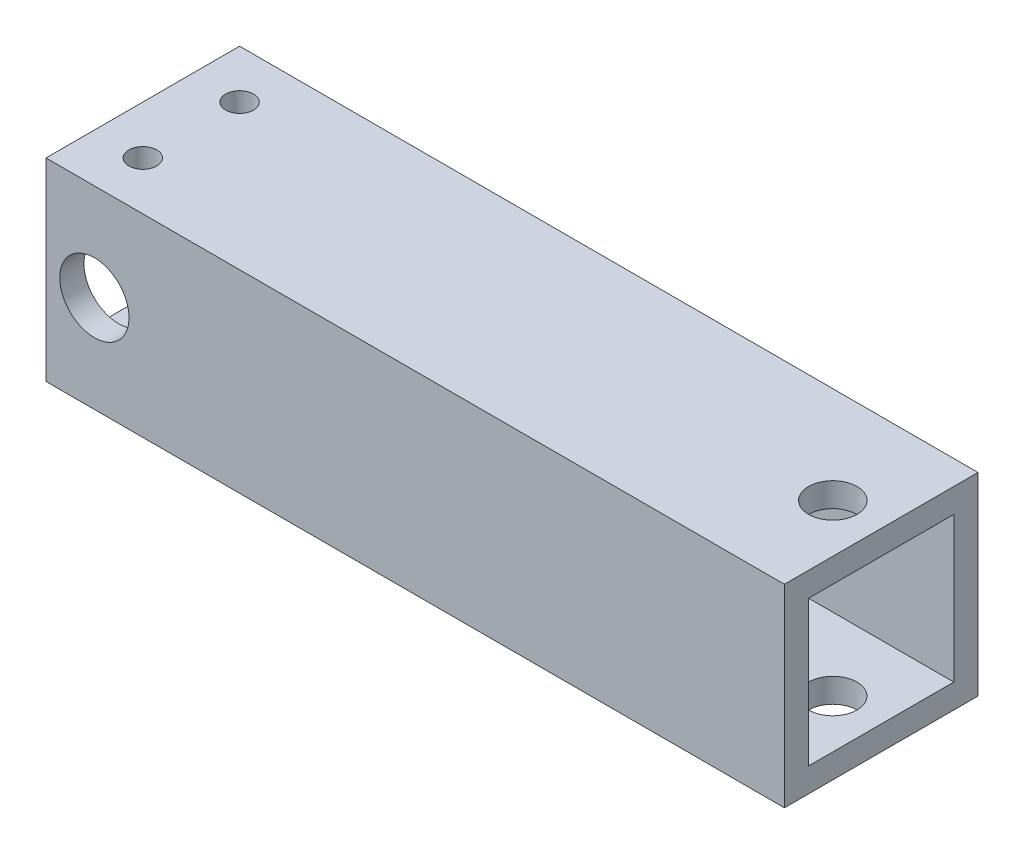
ISO-10303-21;
HEADER;
FILE_DESCRIPTION(('STEP AP214'),'2;1');
FILE_NAME('part.step','',(''),(''),'','','');
FILE_SCHEMA(('AUTOMOTIVE_DESIGN { 1 0 10303 214 1 1 1 1 }'));
ENDSEC;
DATA;
#1=APPLICATION_CONTEXT('core data for automotive mechanical design processes');
#2=APPLICATION_PROTOCOL_DEFINITION('international standard','automotive_design',2000,#1);
#3=PRODUCT_CONTEXT('',#1,'mechanical');
#4=PRODUCT('Part','Part','',(#3));
#5=PRODUCT_RELATED_PRODUCT_CATEGORY('part','',(#4));
#6=PRODUCT_DEFINITION_FORMATION('','',#4);
#7=PRODUCT_DEFINITION_CONTEXT('part definition',#1,'design');
#8=PRODUCT_DEFINITION('design','',#6,#7);
#9=PRODUCT_DEFINITION_SHAPE('','',#8);
#10=(LENGTH_UNIT() NAMED_UNIT(*) SI_UNIT(.MILLI.,.METRE.));
#11=(NAMED_UNIT(*) PLANE_ANGLE_UNIT() SI_UNIT($,.RADIAN.));
#12=(NAMED_UNIT(*) SI_UNIT($,.STERADIAN.) SOLID_ANGLE_UNIT());
#13=UNCERTAINTY_MEASURE_WITH_UNIT(LENGTH_MEASURE(1.E-05),#10,'distance_accuracy_value','');
#14=(GEOMETRIC_REPRESENTATION_CONTEXT(3) GLOBAL_UNCERTAINTY_ASSIGNED_CONTEXT((#13)) GLOBAL_UNIT_ASSIGNED_CONTEXT((#10,
#11,#12)) REPRESENTATION_CONTEXT('',''));
#15=CARTESIAN_POINT('',(0.,0.,0.));
#16=DIRECTION('',(0.,0.,1.));
#17=DIRECTION('',(1.,0.,0.));
#18=AXIS2_PLACEMENT_3D('',#15,#16,#17);
#19=CARTESIAN_POINT('',(-42.926,170.18,-68.2625));
#20=DIRECTION('',(0.,1.,0.));
#21=DIRECTION('',(0.,0.,1.));
#22=AXIS2_PLACEMENT_3D('',#19,#20,#21);
#23=CYLINDRICAL_SURFACE('',#22,1.8288);
#24=CARTESIAN_POINT('',(-42.926,192.405,-68.2625));
#25=DIRECTION('',(0.,1.,0.));
#26=DIRECTION('',(0.,0.,1.));
#27=AXIS2_PLACEMENT_3D('',#24,#25,#26);
#28=CIRCLE('',#27,1.8288);
#29=CARTESIAN_POINT('',(-42.926,192.405,-66.4337));
#30=VERTEX_POINT('',#29);
#31=EDGE_CURVE('E158',#30,#30,#28,.T.);
#32=ORIENTED_EDGE('',*,*,#31,.F.);
#33=EDGE_LOOP('',(#32));
#34=FACE_BOUND('',#33,.T.);
#35=CARTESIAN_POINT('',(-42.926,195.58,-68.2625));
#36=DIRECTION('',(0.,1.,0.));
#37=DIRECTION('',(0.,0.,1.));
#38=AXIS2_PLACEMENT_3D('',#35,#36,#37);
#39=CIRCLE('',#38,1.8288);
#40=CARTESIAN_POINT('',(-42.926,195.58,-66.4337));
#41=VERTEX_POINT('',#40);
#42=EDGE_CURVE('E176',#41,#41,#39,.F.);
#43=ORIENTED_EDGE('',*,*,#42,.F.);
#44=EDGE_LOOP('',(#43));
#45=FACE_BOUND('',#44,.T.);
#46=ADVANCED_FACE('F43',(#34,#45),#23,.F.);
#47=CARTESIAN_POINT('',(41.2500316571236,170.18,-74.6125));
#48=DIRECTION('',(0.,1.,0.));
#49=DIRECTION('',(0.,0.,1.));
#50=AXIS2_PLACEMENT_3D('',#47,#48,#49);
#51=CYLINDRICAL_SURFACE('',#50,3.175);
#52=CARTESIAN_POINT('',(41.2500316571236,192.405,-74.6125));
#53=DIRECTION('',(0.,1.,0.));
#54=DIRECTION('',(0.,0.,1.));
#55=AXIS2_PLACEMENT_3D('',#52,#53,#54);
#56=CIRCLE('',#55,3.175);
#57=CARTESIAN_POINT('',(41.2500316571236,192.405,-71.4375));
#58=VERTEX_POINT('',#57);
#59=EDGE_CURVE('E155',#58,#58,#56,.F.);
#60=ORIENTED_EDGE('',*,*,#59,.T.);
#61=EDGE_LOOP('',(#60));
#62=FACE_BOUND('',#61,.T.);
#63=CARTESIAN_POINT('',(41.2500316571236,195.58,-74.6125));
#64=DIRECTION('',(0.,1.,0.));
#65=DIRECTION('',(0.,0.,1.));
#66=AXIS2_PLACEMENT_3D('',#63,#64,#65);
#67=CIRCLE('',#66,3.175);
#68=CARTESIAN_POINT('',(41.2500316571236,195.58,-71.4375));
#69=VERTEX_POINT('',#68);
#70=EDGE_CURVE('E173',#69,#69,#67,.T.);
#71=ORIENTED_EDGE('',*,*,#70,.T.);
#72=EDGE_LOOP('',(#71));
#73=FACE_BOUND('',#72,.T.);
#74=ADVANCED_FACE('F229',(#62,#73),#51,.F.);
#75=CARTESIAN_POINT('',(-42.926,170.18,-80.9624999999999));
#76=DIRECTION('',(0.,1.,0.));
#77=DIRECTION('',(0.,0.,1.));
#78=AXIS2_PLACEMENT_3D('',#75,#76,#77);
#79=CYLINDRICAL_SURFACE('',#78,1.8288);
#80=CARTESIAN_POINT('',(-42.926,192.405,-80.9624999999999));
#81=DIRECTION('',(0.,1.,0.));
#82=DIRECTION('',(0.,0.,1.));
#83=AXIS2_PLACEMENT_3D('',#80,#81,#82);
#84=CIRCLE('',#83,1.8288);
#85=CARTESIAN_POINT('',(-42.926,192.405,-79.1336999999999));
#86=VERTEX_POINT('',#85);
#87=EDGE_CURVE('E154',#86,#86,#84,.F.);
#88=ORIENTED_EDGE('',*,*,#87,.T.);
#89=EDGE_LOOP('',(#88));
#90=FACE_BOUND('',#89,.T.);
#91=CARTESIAN_POINT('',(-42.926,195.58,-80.9624999999999));
#92=DIRECTION('',(0.,1.,0.));
#93=DIRECTION('',(0.,0.,1.));
#94=AXIS2_PLACEMENT_3D('',#91,#92,#93);
#95=CIRCLE('',#94,1.8288);
#96=CARTESIAN_POINT('',(-42.926,195.58,-79.1336999999999));
#97=VERTEX_POINT('',#96);
#98=EDGE_CURVE('E179',#97,#97,#95,.T.);
#99=ORIENTED_EDGE('',*,*,#98,.T.);
#100=EDGE_LOOP('',(#99));
#101=FACE_BOUND('',#100,.T.);
#102=ADVANCED_FACE('F210',(#90,#101),#79,.F.);
#103=CARTESIAN_POINT('',(-49.276,170.18,0.));
#104=DIRECTION('',(1.,0.,0.));
#105=DIRECTION('',(0.,0.,-1.));
#106=AXIS2_PLACEMENT_3D('',#103,#104,#105);
#107=PLANE('',#106);
#108=DIRECTION('',(0.,-1.,0.));
#109=VECTOR('',#108,1.);
#110=CARTESIAN_POINT('',(-49.276,173.355,-84.1374999999999));
#111=LINE('',#110,#109);
#112=CARTESIAN_POINT('',(-49.276,192.405,-84.1374999999999));
#113=VERTEX_POINT('',#112);
#114=CARTESIAN_POINT('',(-49.276,173.355,-84.1374999999999));
#115=VERTEX_POINT('',#114);
#116=EDGE_CURVE('E134',#113,#115,#111,.T.);
#117=ORIENTED_EDGE('',*,*,#116,.F.);
#118=DIRECTION('',(0.,0.,-1.));
#119=VECTOR('',#118,1.);
#120=CARTESIAN_POINT('',(-49.276,192.405,-84.1374999999999));
#121=LINE('',#120,#119);
#122=CARTESIAN_POINT('',(-49.276,192.405,-65.0875));
#123=VERTEX_POINT('',#122);
#124=EDGE_CURVE('E127',#123,#113,#121,.T.);
#125=ORIENTED_EDGE('',*,*,#124,.F.);
#126=DIRECTION('',(0.,1.,0.));
#127=VECTOR('',#126,1.);
#128=CARTESIAN_POINT('',(-49.276,173.355,-65.0875));
#129=LINE('',#128,#127);
#130=CARTESIAN_POINT('',(-49.276,173.355,-65.0875));
#131=VERTEX_POINT('',#130);
#132=EDGE_CURVE('E138',#131,#123,#129,.T.);
#133=ORIENTED_EDGE('',*,*,#132,.F.);
#134=DIRECTION('',(0.,0.,1.));
#135=VECTOR('',#134,1.);
#136=CARTESIAN_POINT('',(-49.276,173.355,-84.1374999999999));
#137=LINE('',#136,#135);
#138=EDGE_CURVE('E60',#115,#131,#137,.T.);
#139=ORIENTED_EDGE('',*,*,#138,.F.);
#140=EDGE_LOOP('',(#117,#125,#133,#139));
#141=FACE_BOUND('',#140,.T.);
#142=DIRECTION('',(0.,1.,0.));
#143=VECTOR('',#142,1.);
#144=CARTESIAN_POINT('',(-49.276,170.18,-61.9125));
#145=LINE('',#144,#143);
#146=CARTESIAN_POINT('',(-49.276,170.18,-61.9125));
#147=VERTEX_POINT('',#146);
#148=CARTESIAN_POINT('',(-49.276,195.58,-61.9125));
#149=VERTEX_POINT('',#148);
#150=EDGE_CURVE('E200',#147,#149,#145,.T.);
#151=ORIENTED_EDGE('',*,*,#150,.T.);
#152=DIRECTION('',(0.,0.,-1.));
#153=VECTOR('',#152,1.);
#154=CARTESIAN_POINT('',(-49.276,195.58,0.));
#155=LINE('',#154,#153);
#156=CARTESIAN_POINT('',(-49.276,195.58,-87.3124999999999));
#157=VERTEX_POINT('',#156);
#158=EDGE_CURVE('E161',#149,#157,#155,.T.);
#159=ORIENTED_EDGE('',*,*,#158,.T.);
#160=DIRECTION('',(0.,1.,0.));
#161=VECTOR('',#160,1.);
#162=CARTESIAN_POINT('',(-49.276,170.18,-87.3124999999999));
#163=LINE('',#162,#161);
#164=CARTESIAN_POINT('',(-49.276,170.18,-87.3124999999999));
#165=VERTEX_POINT('',#164);
#166=EDGE_CURVE('E11',#165,#157,#163,.T.);
#167=ORIENTED_EDGE('',*,*,#166,.F.);
#168=DIRECTION('',(0.,0.,-1.));
#169=VECTOR('',#168,1.);
#170=CARTESIAN_POINT('',(-49.276,170.18,0.));
#171=LINE('',#170,#169);
#172=EDGE_CURVE('E182',#147,#165,#171,.T.);
#173=ORIENTED_EDGE('',*,*,#172,.F.);
#174=EDGE_LOOP('',(#151,#159,#167,#173));
#175=FACE_BOUND('',#174,.T.);
#176=ADVANCED_FACE('F45',(#141,#175),#107,.F.);
#177=CARTESIAN_POINT('',(0.,170.18,-87.3125));
#178=DIRECTION('',(0.,0.,-1.));
#179=DIRECTION('',(-1.,0.,0.));
#180=AXIS2_PLACEMENT_3D('',#177,#178,#179);
#181=PLANE('',#180);
#182=CARTESIAN_POINT('',(-42.9260000000001,182.88,-87.3125));
#183=DIRECTION('',(0.,0.,-1.));
#184=DIRECTION('',(-1.,0.,0.));
#185=AXIS2_PLACEMENT_3D('',#182,#183,#184);
#186=CIRCLE('',#185,4.54400959726098);
#187=CARTESIAN_POINT('',(-47.470009597261,182.88,-87.3125));
#188=VERTEX_POINT('',#187);
#189=EDGE_CURVE('E311',#188,#188,#186,.T.);
#190=ORIENTED_EDGE('',*,*,#189,.F.);
#191=EDGE_LOOP('',(#190));
#192=FACE_BOUND('',#191,.T.);
#193=ORIENTED_EDGE('',*,*,#166,.T.);
#194=DIRECTION('',(-1.,0.,0.));
#195=VECTOR('',#194,1.);
#196=CARTESIAN_POINT('',(0.,195.58,-87.3125));
#197=LINE('',#196,#195);
#198=CARTESIAN_POINT('',(47.6000316571236,195.58,-87.3125));
#199=VERTEX_POINT('',#198);
#200=EDGE_CURVE('E170',#199,#157,#197,.T.);
#201=ORIENTED_EDGE('',*,*,#200,.F.);
#202=DIRECTION('',(0.,1.,0.));
#203=VECTOR('',#202,1.);
#204=CARTESIAN_POINT('',(47.6000316571236,170.18,-87.3125));
#205=LINE('',#204,#203);
#206=CARTESIAN_POINT('',(47.6000316571236,170.18,-87.3125));
#207=VERTEX_POINT('',#206);
#208=EDGE_CURVE('E52',#207,#199,#205,.T.);
#209=ORIENTED_EDGE('',*,*,#208,.F.);
#210=DIRECTION('',(-1.,0.,0.));
#211=VECTOR('',#210,1.);
#212=CARTESIAN_POINT('',(0.,170.18,-87.3125));
#213=LINE('',#212,#211);
#214=EDGE_CURVE('E189',#207,#165,#213,.T.);
#215=ORIENTED_EDGE('',*,*,#214,.T.);
#216=EDGE_LOOP('',(#193,#201,#209,#215));
#217=FACE_BOUND('',#216,.T.);
#218=ADVANCED_FACE('F250',(#192,#217),#181,.T.);
#219=CARTESIAN_POINT('',(47.6000316571236,170.18,0.));
#220=DIRECTION('',(1.,0.,0.));
#221=DIRECTION('',(0.,0.,-1.));
#222=AXIS2_PLACEMENT_3D('',#219,#220,#221);
#223=PLANE('',#222);
#224=DIRECTION('',(0.,0.,-1.));
#225=VECTOR('',#224,1.);
#226=CARTESIAN_POINT('',(47.6000316571236,192.405,-84.1374999999999));
#227=LINE('',#226,#225);
#228=CARTESIAN_POINT('',(47.6000316571236,192.405,-65.0875));
#229=VERTEX_POINT('',#228);
#230=CARTESIAN_POINT('',(47.6000316571236,192.405,-84.1374999999999));
#231=VERTEX_POINT('',#230);
#232=EDGE_CURVE('E124',#229,#231,#227,.T.);
#233=ORIENTED_EDGE('',*,*,#232,.T.);
#234=DIRECTION('',(0.,-1.,0.));
#235=VECTOR('',#234,1.);
#236=CARTESIAN_POINT('',(47.6000316571236,173.355,-84.1374999999999));
#237=LINE('',#236,#235);
#238=CARTESIAN_POINT('',(47.6000316571236,173.355,-84.1374999999999));
#239=VERTEX_POINT('',#238);
#240=EDGE_CURVE('E110',#231,#239,#237,.T.);
#241=ORIENTED_EDGE('',*,*,#240,.T.);
#242=DIRECTION('',(0.,0.,1.));
#243=VECTOR('',#242,1.);
#244=CARTESIAN_POINT('',(47.6000316571236,173.355,-84.1374999999999));
#245=LINE('',#244,#243);
#246=CARTESIAN_POINT('',(47.6000316571236,173.355,-65.0875));
#247=VERTEX_POINT('',#246);
#248=EDGE_CURVE('E142',#239,#247,#245,.T.);
#249=ORIENTED_EDGE('',*,*,#248,.T.);
#250=DIRECTION('',(0.,1.,0.));
#251=VECTOR('',#250,1.);
#252=CARTESIAN_POINT('',(47.6000316571236,173.355,-65.0875));
#253=LINE('',#252,#251);
#254=EDGE_CURVE('E132',#247,#229,#253,.T.);
#255=ORIENTED_EDGE('',*,*,#254,.T.);
#256=EDGE_LOOP('',(#233,#241,#249,#255));
#257=FACE_BOUND('',#256,.T.);
#258=ORIENTED_EDGE('',*,*,#208,.T.);
#259=DIRECTION('',(0.,0.,-1.));
#260=VECTOR('',#259,1.);
#261=CARTESIAN_POINT('',(47.6000316571236,195.58,0.));
#262=LINE('',#261,#260);
#263=CARTESIAN_POINT('',(47.6000316571236,195.58,-61.9125));
#264=VERTEX_POINT('',#263);
#265=EDGE_CURVE('E167',#264,#199,#262,.T.);
#266=ORIENTED_EDGE('',*,*,#265,.F.);
#267=DIRECTION('',(0.,1.,0.));
#268=VECTOR('',#267,1.);
#269=CARTESIAN_POINT('',(47.6000316571236,170.18,-61.9125));
#270=LINE('',#269,#268);
#271=CARTESIAN_POINT('',(47.6000316571236,170.18,-61.9125));
#272=VERTEX_POINT('',#271);
#273=EDGE_CURVE('E203',#272,#264,#270,.T.);
#274=ORIENTED_EDGE('',*,*,#273,.F.);
#275=DIRECTION('',(0.,0.,-1.));
#276=VECTOR('',#275,1.);
#277=CARTESIAN_POINT('',(47.6000316571236,170.18,0.));
#278=LINE('',#277,#276);
#279=EDGE_CURVE('E186',#272,#207,#278,.T.);
#280=ORIENTED_EDGE('',*,*,#279,.T.);
#281=EDGE_LOOP('',(#258,#266,#274,#280));
#282=FACE_BOUND('',#281,.T.);
#283=ADVANCED_FACE('F130',(#257,#282),#223,.T.);
#284=CARTESIAN_POINT('',(-42.926,173.355,-68.2625));
#285=DIRECTION('',(0.,-1.,0.));
#286=DIRECTION('',(0.,0.,-1.));
#287=AXIS2_PLACEMENT_3D('',#284,#285,#286);
#288=CIRCLE('',#287,1.8288);
#289=CARTESIAN_POINT('',(-42.926,173.355,-70.0913));
#290=VERTEX_POINT('',#289);
#291=EDGE_CURVE('E151',#290,#290,#288,.T.);
#292=ORIENTED_EDGE('',*,*,#291,.F.);
#293=EDGE_LOOP('',(#292));
#294=FACE_BOUND('',#293,.T.);
#295=CARTESIAN_POINT('',(-42.926,170.18,-68.2625));
#296=DIRECTION('',(0.,1.,0.));
#297=DIRECTION('',(0.,0.,1.));
#298=AXIS2_PLACEMENT_3D('',#295,#296,#297);
#299=CIRCLE('',#298,1.8288);
#300=CARTESIAN_POINT('',(-42.926,170.18,-66.4337));
#301=VERTEX_POINT('',#300);
#302=EDGE_CURVE('E195',#301,#301,#299,.F.);
#303=ORIENTED_EDGE('',*,*,#302,.T.);
#304=EDGE_LOOP('',(#303));
#305=FACE_BOUND('',#304,.T.);
#306=ADVANCED_FACE('F232',(#294,#305),#23,.F.);
#307=CARTESIAN_POINT('',(41.2500316571236,173.355,-74.6125));
#308=DIRECTION('',(0.,-1.,0.));
#309=DIRECTION('',(0.,0.,-1.));
#310=AXIS2_PLACEMENT_3D('',#307,#308,#309);
#311=CIRCLE('',#310,3.175);
#312=CARTESIAN_POINT('',(41.2500316571236,173.355,-77.7875));
#313=VERTEX_POINT('',#312);
#314=EDGE_CURVE('E148',#313,#313,#311,.F.);
#315=ORIENTED_EDGE('',*,*,#314,.T.);
#316=EDGE_LOOP('',(#315));
#317=FACE_BOUND('',#316,.T.);
#318=CARTESIAN_POINT('',(41.2500316571236,170.18,-74.6125));
#319=DIRECTION('',(0.,1.,0.));
#320=DIRECTION('',(0.,0.,1.));
#321=AXIS2_PLACEMENT_3D('',#318,#319,#320);
#322=CIRCLE('',#321,3.175);
#323=CARTESIAN_POINT('',(41.2500316571236,170.18,-71.4375));
#324=VERTEX_POINT('',#323);
#325=EDGE_CURVE('E192',#324,#324,#322,.T.);
#326=ORIENTED_EDGE('',*,*,#325,.F.);
#327=EDGE_LOOP('',(#326));
#328=FACE_BOUND('',#327,.T.);
#329=ADVANCED_FACE('F238',(#317,#328),#51,.F.);
#330=CARTESIAN_POINT('',(0.,170.18,-61.9125));
#331=DIRECTION('',(0.,0.,-1.));
#332=DIRECTION('',(-1.,0.,0.));
#333=AXIS2_PLACEMENT_3D('',#330,#331,#332);
#334=PLANE('',#333);
#335=CARTESIAN_POINT('',(-42.9260000000001,182.88,-61.9125));
#336=DIRECTION('',(0.,0.,-1.));
#337=DIRECTION('',(-1.,0.,0.));
#338=AXIS2_PLACEMENT_3D('',#335,#336,#337);
#339=CIRCLE('',#338,4.54400959726098);
#340=CARTESIAN_POINT('',(-47.470009597261,182.88,-61.9125));
#341=VERTEX_POINT('',#340);
#342=EDGE_CURVE('E308',#341,#341,#339,.F.);
#343=ORIENTED_EDGE('',*,*,#342,.F.);
#344=EDGE_LOOP('',(#343));
#345=FACE_BOUND('',#344,.T.);
#346=ORIENTED_EDGE('',*,*,#273,.T.);
#347=DIRECTION('',(-1.,0.,0.));
#348=VECTOR('',#347,1.);
#349=CARTESIAN_POINT('',(0.,195.58,-61.9125));
#350=LINE('',#349,#348);
#351=EDGE_CURVE('E164',#264,#149,#350,.T.);
#352=ORIENTED_EDGE('',*,*,#351,.T.);
#353=ORIENTED_EDGE('',*,*,#150,.F.);
#354=DIRECTION('',(-1.,0.,0.));
#355=VECTOR('',#354,1.);
#356=CARTESIAN_POINT('',(0.,170.18,-61.9125));
#357=LINE('',#356,#355);
#358=EDGE_CURVE('E184',#272,#147,#357,.T.);
#359=ORIENTED_EDGE('',*,*,#358,.F.);
#360=EDGE_LOOP('',(#346,#352,#353,#359));
#361=FACE_BOUND('',#360,.T.);
#362=ADVANCED_FACE('F248',(#345,#361),#334,.F.);
#363=CARTESIAN_POINT('',(-42.926,173.355,-80.9624999999999));
#364=DIRECTION('',(0.,-1.,0.));
#365=DIRECTION('',(0.,0.,-1.));
#366=AXIS2_PLACEMENT_3D('',#363,#364,#365);
#367=CIRCLE('',#366,1.8288);
#368=CARTESIAN_POINT('',(-42.926,173.355,-82.7912999999999));
#369=VERTEX_POINT('',#368);
#370=EDGE_CURVE('E147',#369,#369,#367,.F.);
#371=ORIENTED_EDGE('',*,*,#370,.T.);
#372=EDGE_LOOP('',(#371));
#373=FACE_BOUND('',#372,.T.);
#374=CARTESIAN_POINT('',(-42.926,170.18,-80.9624999999999));
#375=DIRECTION('',(0.,1.,0.));
#376=DIRECTION('',(0.,0.,1.));
#377=AXIS2_PLACEMENT_3D('',#374,#375,#376);
#378=CIRCLE('',#377,1.8288);
#379=CARTESIAN_POINT('',(-42.926,170.18,-79.1336999999999));
#380=VERTEX_POINT('',#379);
#381=EDGE_CURVE('E198',#380,#380,#378,.T.);
#382=ORIENTED_EDGE('',*,*,#381,.F.);
#383=EDGE_LOOP('',(#382));
#384=FACE_BOUND('',#383,.T.);
#385=ADVANCED_FACE('F258',(#373,#384),#79,.F.);
#386=CARTESIAN_POINT('',(0.,170.18,0.));
#387=DIRECTION('',(0.,1.,0.));
#388=DIRECTION('',(0.,0.,1.));
#389=AXIS2_PLACEMENT_3D('',#386,#387,#388);
#390=PLANE('',#389);
#391=ORIENTED_EDGE('',*,*,#172,.T.);
#392=ORIENTED_EDGE('',*,*,#214,.F.);
#393=ORIENTED_EDGE('',*,*,#279,.F.);
#394=ORIENTED_EDGE('',*,*,#358,.T.);
#395=EDGE_LOOP('',(#391,#392,#393,#394));
#396=FACE_BOUND('',#395,.T.);
#397=ORIENTED_EDGE('',*,*,#325,.T.);
#398=EDGE_LOOP('',(#397));
#399=FACE_BOUND('',#398,.T.);
#400=ORIENTED_EDGE('',*,*,#302,.F.);
#401=EDGE_LOOP('',(#400));
#402=FACE_BOUND('',#401,.T.);
#403=ORIENTED_EDGE('',*,*,#381,.T.);
#404=EDGE_LOOP('',(#403));
#405=FACE_BOUND('',#404,.T.);
#406=ADVANCED_FACE('F224',(#396,#399,#402,#405),#390,.F.);
#407=CARTESIAN_POINT('',(0.,195.58,0.));
#408=DIRECTION('',(0.,1.,0.));
#409=DIRECTION('',(0.,0.,1.));
#410=AXIS2_PLACEMENT_3D('',#407,#408,#409);
#411=PLANE('',#410);
#412=ORIENTED_EDGE('',*,*,#158,.F.);
#413=ORIENTED_EDGE('',*,*,#351,.F.);
#414=ORIENTED_EDGE('',*,*,#265,.T.);
#415=ORIENTED_EDGE('',*,*,#200,.T.);
#416=EDGE_LOOP('',(#412,#413,#414,#415));
#417=FACE_BOUND('',#416,.T.);
#418=ORIENTED_EDGE('',*,*,#70,.F.);
#419=EDGE_LOOP('',(#418));
#420=FACE_BOUND('',#419,.T.);
#421=ORIENTED_EDGE('',*,*,#42,.T.);
#422=EDGE_LOOP('',(#421));
#423=FACE_BOUND('',#422,.T.);
#424=ORIENTED_EDGE('',*,*,#98,.F.);
#425=EDGE_LOOP('',(#424));
#426=FACE_BOUND('',#425,.T.);
#427=ADVANCED_FACE('F215',(#417,#420,#423,#426),#411,.T.);
#428=CARTESIAN_POINT('',(74.540800020331,192.405,-84.1374999999999));
#429=DIRECTION('',(0.,1.,0.));
#430=DIRECTION('',(0.,0.,1.));
#431=AXIS2_PLACEMENT_3D('',#428,#429,#430);
#432=PLANE('',#431);
#433=ORIENTED_EDGE('',*,*,#31,.T.);
#434=EDGE_LOOP('',(#433));
#435=FACE_BOUND('',#434,.T.);
#436=ORIENTED_EDGE('',*,*,#87,.F.);
#437=EDGE_LOOP('',(#436));
#438=FACE_BOUND('',#437,.T.);
#439=DIRECTION('',(-1.,0.,0.));
#440=VECTOR('',#439,1.);
#441=CARTESIAN_POINT('',(74.540800020331,192.405,-65.0875));
#442=LINE('',#441,#440);
#443=EDGE_CURVE('E68',#229,#123,#442,.T.);
#444=ORIENTED_EDGE('',*,*,#443,.T.);
#445=ORIENTED_EDGE('',*,*,#124,.T.);
#446=DIRECTION('',(-1.,0.,0.));
#447=VECTOR('',#446,1.);
#448=CARTESIAN_POINT('',(74.540800020331,192.405,-84.1374999999999));
#449=LINE('',#448,#447);
#450=EDGE_CURVE('E114',#231,#113,#449,.T.);
#451=ORIENTED_EDGE('',*,*,#450,.F.);
#452=ORIENTED_EDGE('',*,*,#232,.F.);
#453=EDGE_LOOP('',(#444,#445,#451,#452));
#454=FACE_BOUND('',#453,.T.);
#455=ORIENTED_EDGE('',*,*,#59,.F.);
#456=EDGE_LOOP('',(#455));
#457=FACE_BOUND('',#456,.T.);
#458=ADVANCED_FACE('F122',(#435,#438,#454,#457),#432,.F.);
#459=CARTESIAN_POINT('',(74.540800020331,173.355,-84.1374999999999));
#460=DIRECTION('',(0.,-1.,0.));
#461=DIRECTION('',(0.,0.,-1.));
#462=AXIS2_PLACEMENT_3D('',#459,#460,#461);
#463=PLANE('',#462);
#464=ORIENTED_EDGE('',*,*,#291,.T.);
#465=EDGE_LOOP('',(#464));
#466=FACE_BOUND('',#465,.T.);
#467=ORIENTED_EDGE('',*,*,#370,.F.);
#468=EDGE_LOOP('',(#467));
#469=FACE_BOUND('',#468,.T.);
#470=DIRECTION('',(-1.,0.,0.));
#471=VECTOR('',#470,1.);
#472=CARTESIAN_POINT('',(74.540800020331,173.355,-84.1374999999999));
#473=LINE('',#472,#471);
#474=EDGE_CURVE('E116',#239,#115,#473,.T.);
#475=ORIENTED_EDGE('',*,*,#474,.T.);
#476=ORIENTED_EDGE('',*,*,#138,.T.);
#477=DIRECTION('',(-1.,0.,0.));
#478=VECTOR('',#477,1.);
#479=CARTESIAN_POINT('',(74.540800020331,173.355,-65.0875));
#480=LINE('',#479,#478);
#481=EDGE_CURVE('E141',#247,#131,#480,.T.);
#482=ORIENTED_EDGE('',*,*,#481,.F.);
#483=ORIENTED_EDGE('',*,*,#248,.F.);
#484=EDGE_LOOP('',(#475,#476,#482,#483));
#485=FACE_BOUND('',#484,.T.);
#486=ORIENTED_EDGE('',*,*,#314,.F.);
#487=EDGE_LOOP('',(#486));
#488=FACE_BOUND('',#487,.T.);
#489=ADVANCED_FACE('F214',(#466,#469,#485,#488),#463,.F.);
#490=CARTESIAN_POINT('',(74.540800020331,173.355,-84.1374999999999));
#491=DIRECTION('',(0.,0.,-1.));
#492=DIRECTION('',(-1.,0.,0.));
#493=AXIS2_PLACEMENT_3D('',#490,#491,#492);
#494=PLANE('',#493);
#495=CARTESIAN_POINT('',(-42.9260000000001,182.88,-84.1374999999999));
#496=DIRECTION('',(0.,0.,-1.));
#497=DIRECTION('',(-1.,0.,0.));
#498=AXIS2_PLACEMENT_3D('',#495,#496,#497);
#499=CIRCLE('',#498,4.54400959726098);
#500=CARTESIAN_POINT('',(-47.470009597261,182.88,-84.1374999999999));
#501=VERTEX_POINT('',#500);
#502=EDGE_CURVE('E305',#501,#501,#499,.T.);
#503=ORIENTED_EDGE('',*,*,#502,.T.);
#504=EDGE_LOOP('',(#503));
#505=FACE_BOUND('',#504,.T.);
#506=ORIENTED_EDGE('',*,*,#450,.T.);
#507=ORIENTED_EDGE('',*,*,#116,.T.);
#508=ORIENTED_EDGE('',*,*,#474,.F.);
#509=ORIENTED_EDGE('',*,*,#240,.F.);
#510=EDGE_LOOP('',(#506,#507,#508,#509));
#511=FACE_BOUND('',#510,.T.);
#512=ADVANCED_FACE('F112',(#505,#511),#494,.F.);
#513=CARTESIAN_POINT('',(74.540800020331,173.355,-65.0875));
#514=DIRECTION('',(0.,0.,1.));
#515=DIRECTION('',(1.,0.,0.));
#516=AXIS2_PLACEMENT_3D('',#513,#514,#515);
#517=PLANE('',#516);
#518=CARTESIAN_POINT('',(-42.9260000000001,182.88,-65.0875));
#519=DIRECTION('',(0.,0.,1.));
#520=DIRECTION('',(1.,0.,0.));
#521=AXIS2_PLACEMENT_3D('',#518,#519,#520);
#522=CIRCLE('',#521,4.54400959726098);
#523=CARTESIAN_POINT('',(-38.3819904027391,182.88,-65.0875));
#524=VERTEX_POINT('',#523);
#525=EDGE_CURVE('E47',#524,#524,#522,.T.);
#526=ORIENTED_EDGE('',*,*,#525,.T.);
#527=EDGE_LOOP('',(#526));
#528=FACE_BOUND('',#527,.T.);
#529=ORIENTED_EDGE('',*,*,#481,.T.);
#530=ORIENTED_EDGE('',*,*,#132,.T.);
#531=ORIENTED_EDGE('',*,*,#443,.F.);
#532=ORIENTED_EDGE('',*,*,#254,.F.);
#533=EDGE_LOOP('',(#529,#530,#531,#532));
#534=FACE_BOUND('',#533,.T.);
#535=ADVANCED_FACE('F323',(#528,#534),#517,.F.);
#536=CARTESIAN_POINT('',(-42.9260000000001,182.88,-49.0601));
#537=DIRECTION('',(0.,0.,-1.));
#538=DIRECTION('',(-1.,0.,0.));
#539=AXIS2_PLACEMENT_3D('',#536,#537,#538);
#540=CYLINDRICAL_SURFACE('',#539,4.54400959726098);
#541=ORIENTED_EDGE('',*,*,#342,.T.);
#542=EDGE_LOOP('',(#541));
#543=FACE_BOUND('',#542,.T.);
#544=ORIENTED_EDGE('',*,*,#525,.F.);
#545=EDGE_LOOP('',(#544));
#546=FACE_BOUND('',#545,.T.);
#547=ADVANCED_FACE('F318',(#543,#546),#540,.F.);
#548=ORIENTED_EDGE('',*,*,#189,.T.);
#549=EDGE_LOOP('',(#548));
#550=FACE_BOUND('',#549,.T.);
#551=ORIENTED_EDGE('',*,*,#502,.F.);
#552=EDGE_LOOP('',(#551));
#553=FACE_BOUND('',#552,.T.);
#554=ADVANCED_FACE('F315',(#550,#553),#540,.F.);
#555=CLOSED_SHELL('',(#46,#74,#102,#176,#218,#283,#306,#329,#362,#385,#406,#427,#458,#489,#512,
#535,#547,#554));
#556=MANIFOLD_SOLID_BREP('B2',#555);
#557=ADVANCED_BREP_SHAPE_REPRESENTATION('',(#18,#556),#14);
#558=SHAPE_DEFINITION_REPRESENTATION(#9,#557);
ENDSEC;
END-ISO-10303-21;
